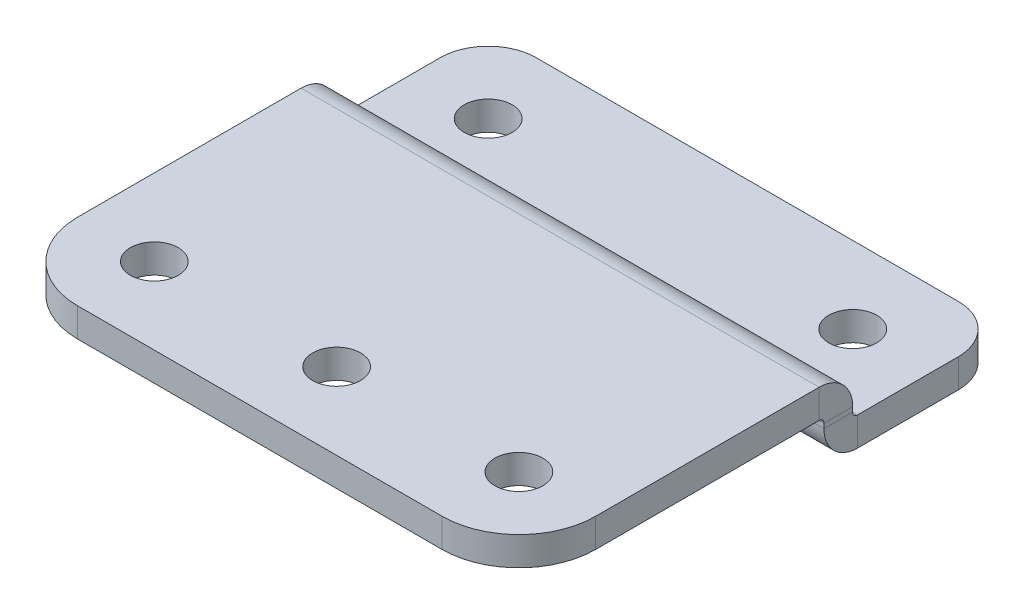
ISO-10303-21;
HEADER;
FILE_DESCRIPTION(('STEP AP214'),'2;1');
FILE_NAME('part.step','',(''),(''),'','','');
FILE_SCHEMA(('AUTOMOTIVE_DESIGN { 1 0 10303 214 1 1 1 1 }'));
ENDSEC;
DATA;
#1=APPLICATION_CONTEXT('core data for automotive mechanical design processes');
#2=APPLICATION_PROTOCOL_DEFINITION('international standard','automotive_design',2000,#1);
#3=PRODUCT_CONTEXT('',#1,'mechanical');
#4=PRODUCT('Part','Part','',(#3));
#5=PRODUCT_RELATED_PRODUCT_CATEGORY('part','',(#4));
#6=PRODUCT_DEFINITION_FORMATION('','',#4);
#7=PRODUCT_DEFINITION_CONTEXT('part definition',#1,'design');
#8=PRODUCT_DEFINITION('design','',#6,#7);
#9=PRODUCT_DEFINITION_SHAPE('','',#8);
#10=(LENGTH_UNIT() NAMED_UNIT(*) SI_UNIT(.MILLI.,.METRE.));
#11=(NAMED_UNIT(*) PLANE_ANGLE_UNIT() SI_UNIT($,.RADIAN.));
#12=(NAMED_UNIT(*) SI_UNIT($,.STERADIAN.) SOLID_ANGLE_UNIT());
#13=UNCERTAINTY_MEASURE_WITH_UNIT(LENGTH_MEASURE(1.E-05),#10,'distance_accuracy_value','');
#14=(GEOMETRIC_REPRESENTATION_CONTEXT(3) GLOBAL_UNCERTAINTY_ASSIGNED_CONTEXT((#13)) GLOBAL_UNIT_ASSIGNED_CONTEXT((#10,
#11,#12)) REPRESENTATION_CONTEXT('',''));
#15=CARTESIAN_POINT('',(0.,0.,0.));
#16=DIRECTION('',(0.,0.,1.));
#17=DIRECTION('',(1.,0.,0.));
#18=AXIS2_PLACEMENT_3D('',#15,#16,#17);
#19=CARTESIAN_POINT('',(0.,4.5,2.99999999999999));
#20=DIRECTION('',(1.,0.,0.));
#21=DIRECTION('',(0.,0.,-1.));
#22=AXIS2_PLACEMENT_3D('',#19,#20,#21);
#23=PLANE('',#22);
#24=DIRECTION('',(0.,1.,0.));
#25=VECTOR('',#24,1.);
#26=CARTESIAN_POINT('',(0.,-3.00000000000003,26.8));
#27=LINE('',#26,#25);
#28=CARTESIAN_POINT('',(0.,1.50000000000011,26.8));
#29=VERTEX_POINT('',#28);
#30=CARTESIAN_POINT('',(0.,4.50000000000008,26.8));
#31=VERTEX_POINT('',#30);
#32=EDGE_CURVE('E232',#29,#31,#27,.T.);
#33=ORIENTED_EDGE('',*,*,#32,.T.);
#34=DIRECTION('',(0.,0.,-1.));
#35=VECTOR('',#34,1.);
#36=CARTESIAN_POINT('',(0.,4.49999999999999,0.));
#37=LINE('',#36,#35);
#38=CARTESIAN_POINT('',(0.,4.5,3.49999999999999));
#39=VERTEX_POINT('',#38);
#40=EDGE_CURVE('E243',#39,#31,#37,.F.);
#41=ORIENTED_EDGE('',*,*,#40,.F.);
#42=DIRECTION('',(0.,-1.,0.));
#43=VECTOR('',#42,1.);
#44=CARTESIAN_POINT('',(0.,1.5,3.5));
#45=LINE('',#44,#43);
#46=CARTESIAN_POINT('',(0.,1.5,3.5));
#47=VERTEX_POINT('',#46);
#48=EDGE_CURVE('E264',#47,#39,#45,.F.);
#49=ORIENTED_EDGE('',*,*,#48,.F.);
#50=DIRECTION('',(0.,0.,1.));
#51=VECTOR('',#50,1.);
#52=CARTESIAN_POINT('',(0.,1.5,3.));
#53=LINE('',#52,#51);
#54=EDGE_CURVE('E245',#47,#29,#53,.T.);
#55=ORIENTED_EDGE('',*,*,#54,.T.);
#56=EDGE_LOOP('',(#33,#41,#49,#55));
#57=FACE_BOUND('',#56,.T.);
#58=ADVANCED_FACE('F117',(#57),#23,.F.);
#59=CARTESIAN_POINT('',(54.,4.50000000000011,34.8));
#60=DIRECTION('',(-1.,0.,0.));
#61=DIRECTION('',(0.,0.,1.));
#62=AXIS2_PLACEMENT_3D('',#59,#60,#61);
#63=PLANE('',#62);
#64=DIRECTION('',(0.,1.,0.));
#65=VECTOR('',#64,1.);
#66=CARTESIAN_POINT('',(54.,-3.00000000000003,26.8));
#67=LINE('',#66,#65);
#68=CARTESIAN_POINT('',(54.,1.50000000000009,26.8));
#69=VERTEX_POINT('',#68);
#70=CARTESIAN_POINT('',(54.,4.50000000000008,26.8));
#71=VERTEX_POINT('',#70);
#72=EDGE_CURVE('E530',#69,#71,#67,.T.);
#73=ORIENTED_EDGE('',*,*,#72,.F.);
#74=DIRECTION('',(0.,0.,-1.));
#75=VECTOR('',#74,1.);
#76=CARTESIAN_POINT('',(54.,1.50000000000011,34.8));
#77=LINE('',#76,#75);
#78=CARTESIAN_POINT('',(54.,1.5,3.5));
#79=VERTEX_POINT('',#78);
#80=EDGE_CURVE('E252',#69,#79,#77,.T.);
#81=ORIENTED_EDGE('',*,*,#80,.T.);
#82=DIRECTION('',(0.,-1.,0.));
#83=VECTOR('',#82,1.);
#84=CARTESIAN_POINT('',(54.,4.5,3.49999999999998));
#85=LINE('',#84,#83);
#86=CARTESIAN_POINT('',(54.,4.5,3.49999999999999));
#87=VERTEX_POINT('',#86);
#88=EDGE_CURVE('E269',#79,#87,#85,.F.);
#89=ORIENTED_EDGE('',*,*,#88,.T.);
#90=DIRECTION('',(0.,0.,1.));
#91=VECTOR('',#90,1.);
#92=CARTESIAN_POINT('',(54.,4.49999999999999,0.));
#93=LINE('',#92,#91);
#94=EDGE_CURVE('E254',#71,#87,#93,.F.);
#95=ORIENTED_EDGE('',*,*,#94,.F.);
#96=EDGE_LOOP('',(#73,#81,#89,#95));
#97=FACE_BOUND('',#96,.T.);
#98=ADVANCED_FACE('F413',(#97),#63,.F.);
#99=CARTESIAN_POINT('',(0.,4.49999999999999,0.));
#100=DIRECTION('',(0.,1.,0.));
#101=DIRECTION('',(0.,0.,1.));
#102=AXIS2_PLACEMENT_3D('',#99,#100,#101);
#103=PLANE('',#102);
#104=CARTESIAN_POINT('',(46.,4.50000000000008,26.8));
#105=DIRECTION('',(0.,1.,0.));
#106=DIRECTION('',(0.,0.,1.));
#107=AXIS2_PLACEMENT_3D('',#104,#105,#106);
#108=CIRCLE('',#107,2.5);
#109=CARTESIAN_POINT('',(46.,4.50000000000009,29.3));
#110=VERTEX_POINT('',#109);
#111=EDGE_CURVE('E807',#110,#110,#108,.T.);
#112=ORIENTED_EDGE('',*,*,#111,.F.);
#113=EDGE_LOOP('',(#112));
#114=FACE_BOUND('',#113,.T.);
#115=CARTESIAN_POINT('',(27.,4.50000000000008,26.8));
#116=DIRECTION('',(0.,1.,0.));
#117=DIRECTION('',(0.,0.,1.));
#118=AXIS2_PLACEMENT_3D('',#115,#116,#117);
#119=CIRCLE('',#118,2.5);
#120=CARTESIAN_POINT('',(27.,4.50000000000009,29.3));
#121=VERTEX_POINT('',#120);
#122=EDGE_CURVE('E811',#121,#121,#119,.T.);
#123=ORIENTED_EDGE('',*,*,#122,.F.);
#124=EDGE_LOOP('',(#123));
#125=FACE_BOUND('',#124,.T.);
#126=CARTESIAN_POINT('',(8.,4.50000000000008,26.8));
#127=DIRECTION('',(0.,1.,0.));
#128=DIRECTION('',(0.,0.,1.));
#129=AXIS2_PLACEMENT_3D('',#126,#127,#128);
#130=CIRCLE('',#129,2.5);
#131=CARTESIAN_POINT('',(8.,4.50000000000009,29.3));
#132=VERTEX_POINT('',#131);
#133=EDGE_CURVE('E237',#132,#132,#130,.F.);
#134=ORIENTED_EDGE('',*,*,#133,.T.);
#135=EDGE_LOOP('',(#134));
#136=FACE_BOUND('',#135,.T.);
#137=CARTESIAN_POINT('',(8.,4.50000000000008,26.8));
#138=DIRECTION('',(0.,1.,0.));
#139=DIRECTION('',(0.,0.,1.));
#140=AXIS2_PLACEMENT_3D('',#137,#138,#139);
#141=CIRCLE('',#140,8.);
#142=CARTESIAN_POINT('',(8.,4.50000000000011,34.8));
#143=VERTEX_POINT('',#142);
#144=EDGE_CURVE('E229',#143,#31,#141,.F.);
#145=ORIENTED_EDGE('',*,*,#144,.F.);
#146=DIRECTION('',(-1.,0.,0.));
#147=VECTOR('',#146,1.);
#148=CARTESIAN_POINT('',(0.,4.50000000000011,34.8));
#149=LINE('',#148,#147);
#150=CARTESIAN_POINT('',(46.,4.50000000000011,34.8));
#151=VERTEX_POINT('',#150);
#152=EDGE_CURVE('E251',#143,#151,#149,.F.);
#153=ORIENTED_EDGE('',*,*,#152,.T.);
#154=CARTESIAN_POINT('',(46.,4.50000000000008,26.8));
#155=DIRECTION('',(0.,1.,0.));
#156=DIRECTION('',(0.,0.,1.));
#157=AXIS2_PLACEMENT_3D('',#154,#155,#156);
#158=CIRCLE('',#157,8.);
#159=EDGE_CURVE('E134',#151,#71,#158,.T.);
#160=ORIENTED_EDGE('',*,*,#159,.T.);
#161=ORIENTED_EDGE('',*,*,#94,.T.);
#162=DIRECTION('',(-1.,0.,0.));
#163=VECTOR('',#162,1.);
#164=CARTESIAN_POINT('',(0.,4.5,3.49999999999999));
#165=LINE('',#164,#163);
#166=EDGE_CURVE('E250',#87,#39,#165,.T.);
#167=ORIENTED_EDGE('',*,*,#166,.T.);
#168=ORIENTED_EDGE('',*,*,#40,.T.);
#169=EDGE_LOOP('',(#145,#153,#160,#161,#167,#168));
#170=FACE_BOUND('',#169,.T.);
#171=ADVANCED_FACE('F248',(#114,#125,#136,#170),#103,.T.);
#172=CARTESIAN_POINT('',(0.,1.49999999999999,0.));
#173=DIRECTION('',(0.,1.,0.));
#174=DIRECTION('',(0.,0.,1.));
#175=AXIS2_PLACEMENT_3D('',#172,#173,#174);
#176=PLANE('',#175);
#177=CARTESIAN_POINT('',(27.,1.50000000000008,26.8));
#178=DIRECTION('',(0.,1.,0.));
#179=DIRECTION('',(0.,0.,1.));
#180=AXIS2_PLACEMENT_3D('',#177,#178,#179);
#181=CIRCLE('',#180,2.5);
#182=CARTESIAN_POINT('',(27.,1.50000000000009,29.3));
#183=VERTEX_POINT('',#182);
#184=EDGE_CURVE('E390',#183,#183,#181,.T.);
#185=ORIENTED_EDGE('',*,*,#184,.T.);
#186=EDGE_LOOP('',(#185));
#187=FACE_BOUND('',#186,.T.);
#188=CARTESIAN_POINT('',(8.,1.50000000000008,26.8));
#189=DIRECTION('',(0.,1.,0.));
#190=DIRECTION('',(0.,0.,1.));
#191=AXIS2_PLACEMENT_3D('',#188,#189,#190);
#192=CIRCLE('',#191,2.5);
#193=CARTESIAN_POINT('',(8.,1.50000000000009,29.3));
#194=VERTEX_POINT('',#193);
#195=EDGE_CURVE('E388',#194,#194,#192,.F.);
#196=ORIENTED_EDGE('',*,*,#195,.F.);
#197=EDGE_LOOP('',(#196));
#198=FACE_BOUND('',#197,.T.);
#199=CARTESIAN_POINT('',(46.,1.50000000000008,26.8));
#200=DIRECTION('',(0.,1.,0.));
#201=DIRECTION('',(0.,0.,1.));
#202=AXIS2_PLACEMENT_3D('',#199,#200,#201);
#203=CIRCLE('',#202,2.5);
#204=CARTESIAN_POINT('',(46.,1.50000000000009,29.3));
#205=VERTEX_POINT('',#204);
#206=EDGE_CURVE('E121',#205,#205,#203,.T.);
#207=ORIENTED_EDGE('',*,*,#206,.T.);
#208=EDGE_LOOP('',(#207));
#209=FACE_BOUND('',#208,.T.);
#210=DIRECTION('',(1.,0.,0.));
#211=VECTOR('',#210,1.);
#212=CARTESIAN_POINT('',(0.,1.50000000000011,34.8));
#213=LINE('',#212,#211);
#214=CARTESIAN_POINT('',(8.,1.50000000000011,34.8));
#215=VERTEX_POINT('',#214);
#216=CARTESIAN_POINT('',(46.,1.5000000000001,34.8));
#217=VERTEX_POINT('',#216);
#218=EDGE_CURVE('E256',#215,#217,#213,.T.);
#219=ORIENTED_EDGE('',*,*,#218,.F.);
#220=CARTESIAN_POINT('',(8.,1.50000000000008,26.8));
#221=DIRECTION('',(0.,1.,0.));
#222=DIRECTION('',(0.,0.,1.));
#223=AXIS2_PLACEMENT_3D('',#220,#221,#222);
#224=CIRCLE('',#223,8.);
#225=EDGE_CURVE('E142',#215,#29,#224,.F.);
#226=ORIENTED_EDGE('',*,*,#225,.T.);
#227=ORIENTED_EDGE('',*,*,#54,.F.);
#228=DIRECTION('',(1.,0.,0.));
#229=VECTOR('',#228,1.);
#230=CARTESIAN_POINT('',(54.,1.5,3.5));
#231=LINE('',#230,#229);
#232=EDGE_CURVE('E267',#79,#47,#231,.F.);
#233=ORIENTED_EDGE('',*,*,#232,.F.);
#234=ORIENTED_EDGE('',*,*,#80,.F.);
#235=CARTESIAN_POINT('',(46.,1.50000000000008,26.8));
#236=DIRECTION('',(0.,1.,0.));
#237=DIRECTION('',(0.,0.,1.));
#238=AXIS2_PLACEMENT_3D('',#235,#236,#237);
#239=CIRCLE('',#238,8.);
#240=EDGE_CURVE('E533',#217,#69,#239,.T.);
#241=ORIENTED_EDGE('',*,*,#240,.F.);
#242=EDGE_LOOP('',(#219,#226,#227,#233,#234,#241));
#243=FACE_BOUND('',#242,.T.);
#244=ADVANCED_FACE('F397',(#187,#198,#209,#243),#176,.F.);
#245=CARTESIAN_POINT('',(54.,-3.,0.));
#246=DIRECTION('',(1.,0.,0.));
#247=DIRECTION('',(0.,0.,-1.));
#248=AXIS2_PLACEMENT_3D('',#245,#246,#247);
#249=PLANE('',#248);
#250=DIRECTION('',(0.,0.,-1.));
#251=VECTOR('',#250,1.);
#252=CARTESIAN_POINT('',(54.,0.,0.));
#253=LINE('',#252,#251);
#254=CARTESIAN_POINT('',(54.,0.,-0.499999999999999));
#255=VERTEX_POINT('',#254);
#256=CARTESIAN_POINT('',(54.,0.,-11.));
#257=VERTEX_POINT('',#256);
#258=EDGE_CURVE('E369',#255,#257,#253,.T.);
#259=ORIENTED_EDGE('',*,*,#258,.F.);
#260=DIRECTION('',(0.,-1.,0.));
#261=VECTOR('',#260,1.);
#262=CARTESIAN_POINT('',(54.,0.,-0.499999999999999));
#263=LINE('',#262,#261);
#264=CARTESIAN_POINT('',(54.,-3.,-0.499999999999999));
#265=VERTEX_POINT('',#264);
#266=EDGE_CURVE('E323',#255,#265,#263,.T.);
#267=ORIENTED_EDGE('',*,*,#266,.T.);
#268=DIRECTION('',(0.,0.,-1.));
#269=VECTOR('',#268,1.);
#270=CARTESIAN_POINT('',(54.,-3.,0.));
#271=LINE('',#270,#269);
#272=CARTESIAN_POINT('',(54.,-3.,-11.));
#273=VERTEX_POINT('',#272);
#274=EDGE_CURVE('E354',#265,#273,#271,.T.);
#275=ORIENTED_EDGE('',*,*,#274,.T.);
#276=DIRECTION('',(0.,1.,0.));
#277=VECTOR('',#276,1.);
#278=CARTESIAN_POINT('',(54.,-3.,-11.));
#279=LINE('',#278,#277);
#280=EDGE_CURVE('E366',#273,#257,#279,.T.);
#281=ORIENTED_EDGE('',*,*,#280,.T.);
#282=EDGE_LOOP('',(#259,#267,#275,#281));
#283=FACE_BOUND('',#282,.T.);
#284=ADVANCED_FACE('F484',(#283),#249,.T.);
#285=CARTESIAN_POINT('',(4.99999999999999,-3.,-11.));
#286=DIRECTION('',(0.,-1.,0.));
#287=DIRECTION('',(0.,0.,-1.));
#288=AXIS2_PLACEMENT_3D('',#285,#286,#287);
#289=PLANE('',#288);
#290=CARTESIAN_POINT('',(46.,-3.,-8.00000000000001));
#291=DIRECTION('',(0.,1.,0.));
#292=DIRECTION('',(0.,0.,-1.));
#293=AXIS2_PLACEMENT_3D('',#290,#291,#292);
#294=CIRCLE('',#293,2.5);
#295=CARTESIAN_POINT('',(46.,-3.,-10.5));
#296=VERTEX_POINT('',#295);
#297=EDGE_CURVE('E339',#296,#296,#294,.T.);
#298=ORIENTED_EDGE('',*,*,#297,.T.);
#299=EDGE_LOOP('',(#298));
#300=FACE_BOUND('',#299,.T.);
#301=CARTESIAN_POINT('',(8.,-3.,-8.));
#302=DIRECTION('',(0.,1.,0.));
#303=DIRECTION('',(0.,0.,1.));
#304=AXIS2_PLACEMENT_3D('',#301,#302,#303);
#305=CIRCLE('',#304,2.5);
#306=CARTESIAN_POINT('',(8.,-3.,-5.5));
#307=VERTEX_POINT('',#306);
#308=EDGE_CURVE('E345',#307,#307,#305,.T.);
#309=ORIENTED_EDGE('',*,*,#308,.T.);
#310=EDGE_LOOP('',(#309));
#311=FACE_BOUND('',#310,.T.);
#312=ORIENTED_EDGE('',*,*,#274,.F.);
#313=DIRECTION('',(1.,0.,0.));
#314=VECTOR('',#313,1.);
#315=CARTESIAN_POINT('',(54.,-3.,-0.499999999999999));
#316=LINE('',#315,#314);
#317=CARTESIAN_POINT('',(0.,-3.,-0.499999999999999));
#318=VERTEX_POINT('',#317);
#319=EDGE_CURVE('E316',#265,#318,#316,.F.);
#320=ORIENTED_EDGE('',*,*,#319,.T.);
#321=DIRECTION('',(0.,0.,1.));
#322=VECTOR('',#321,1.);
#323=CARTESIAN_POINT('',(0.,-3.,0.));
#324=LINE('',#323,#322);
#325=CARTESIAN_POINT('',(0.,-3.,-11.));
#326=VERTEX_POINT('',#325);
#327=EDGE_CURVE('E351',#326,#318,#324,.T.);
#328=ORIENTED_EDGE('',*,*,#327,.F.);
#329=CARTESIAN_POINT('',(4.99999999999999,-3.,-11.));
#330=DIRECTION('',(0.,1.,0.));
#331=DIRECTION('',(0.,0.,-1.));
#332=AXIS2_PLACEMENT_3D('',#329,#330,#331);
#333=CIRCLE('',#332,5.);
#334=CARTESIAN_POINT('',(4.99999999999999,-3.,-16.));
#335=VERTEX_POINT('',#334);
#336=EDGE_CURVE('E363',#335,#326,#333,.T.);
#337=ORIENTED_EDGE('',*,*,#336,.F.);
#338=DIRECTION('',(-1.,0.,0.));
#339=VECTOR('',#338,1.);
#340=CARTESIAN_POINT('',(4.99999999999999,-3.,-16.));
#341=LINE('',#340,#339);
#342=CARTESIAN_POINT('',(49.,-3.,-16.));
#343=VERTEX_POINT('',#342);
#344=EDGE_CURVE('E360',#343,#335,#341,.T.);
#345=ORIENTED_EDGE('',*,*,#344,.F.);
#346=CARTESIAN_POINT('',(49.,-3.,-11.));
#347=DIRECTION('',(0.,1.,0.));
#348=DIRECTION('',(0.,0.,-1.));
#349=AXIS2_PLACEMENT_3D('',#346,#347,#348);
#350=CIRCLE('',#349,5.);
#351=EDGE_CURVE('E357',#273,#343,#350,.T.);
#352=ORIENTED_EDGE('',*,*,#351,.F.);
#353=EDGE_LOOP('',(#312,#320,#328,#337,#345,#352));
#354=FACE_BOUND('',#353,.T.);
#355=ADVANCED_FACE('F480',(#300,#311,#354),#289,.T.);
#356=CARTESIAN_POINT('',(4.99999999999999,0.,-11.));
#357=DIRECTION('',(0.,-1.,0.));
#358=DIRECTION('',(0.,0.,-1.));
#359=AXIS2_PLACEMENT_3D('',#356,#357,#358);
#360=PLANE('',#359);
#361=CARTESIAN_POINT('',(8.,0.,-8.));
#362=DIRECTION('',(0.,1.,0.));
#363=DIRECTION('',(0.,0.,1.));
#364=AXIS2_PLACEMENT_3D('',#361,#362,#363);
#365=CIRCLE('',#364,2.5);
#366=CARTESIAN_POINT('',(8.,0.,-5.5));
#367=VERTEX_POINT('',#366);
#368=EDGE_CURVE('E342',#367,#367,#365,.T.);
#369=ORIENTED_EDGE('',*,*,#368,.F.);
#370=EDGE_LOOP('',(#369));
#371=FACE_BOUND('',#370,.T.);
#372=CARTESIAN_POINT('',(46.,0.,-8.00000000000001));
#373=DIRECTION('',(0.,1.,0.));
#374=DIRECTION('',(0.,0.,-1.));
#375=AXIS2_PLACEMENT_3D('',#372,#373,#374);
#376=CIRCLE('',#375,2.5);
#377=CARTESIAN_POINT('',(46.,0.,-10.5));
#378=VERTEX_POINT('',#377);
#379=EDGE_CURVE('E336',#378,#378,#376,.T.);
#380=ORIENTED_EDGE('',*,*,#379,.F.);
#381=EDGE_LOOP('',(#380));
#382=FACE_BOUND('',#381,.T.);
#383=DIRECTION('',(1.,0.,0.));
#384=VECTOR('',#383,1.);
#385=CARTESIAN_POINT('',(54.,0.,-0.499999999999999));
#386=LINE('',#385,#384);
#387=CARTESIAN_POINT('',(0.,0.,-0.499999999999999));
#388=VERTEX_POINT('',#387);
#389=EDGE_CURVE('E329',#255,#388,#386,.F.);
#390=ORIENTED_EDGE('',*,*,#389,.F.);
#391=ORIENTED_EDGE('',*,*,#258,.T.);
#392=CARTESIAN_POINT('',(49.,0.,-11.));
#393=DIRECTION('',(0.,1.,0.));
#394=DIRECTION('',(0.,0.,-1.));
#395=AXIS2_PLACEMENT_3D('',#392,#393,#394);
#396=CIRCLE('',#395,5.);
#397=CARTESIAN_POINT('',(49.,0.,-16.));
#398=VERTEX_POINT('',#397);
#399=EDGE_CURVE('E371',#257,#398,#396,.T.);
#400=ORIENTED_EDGE('',*,*,#399,.T.);
#401=DIRECTION('',(-1.,0.,0.));
#402=VECTOR('',#401,1.);
#403=CARTESIAN_POINT('',(4.99999999999999,0.,-16.));
#404=LINE('',#403,#402);
#405=CARTESIAN_POINT('',(4.99999999999999,0.,-16.));
#406=VERTEX_POINT('',#405);
#407=EDGE_CURVE('E374',#398,#406,#404,.T.);
#408=ORIENTED_EDGE('',*,*,#407,.T.);
#409=CARTESIAN_POINT('',(4.99999999999999,0.,-11.));
#410=DIRECTION('',(0.,1.,0.));
#411=DIRECTION('',(0.,0.,-1.));
#412=AXIS2_PLACEMENT_3D('',#409,#410,#411);
#413=CIRCLE('',#412,5.);
#414=CARTESIAN_POINT('',(0.,0.,-11.));
#415=VERTEX_POINT('',#414);
#416=EDGE_CURVE('E355',#406,#415,#413,.T.);
#417=ORIENTED_EDGE('',*,*,#416,.T.);
#418=DIRECTION('',(0.,0.,1.));
#419=VECTOR('',#418,1.);
#420=CARTESIAN_POINT('',(0.,0.,0.));
#421=LINE('',#420,#419);
#422=EDGE_CURVE('E348',#415,#388,#421,.T.);
#423=ORIENTED_EDGE('',*,*,#422,.T.);
#424=EDGE_LOOP('',(#390,#391,#400,#408,#417,#423));
#425=FACE_BOUND('',#424,.T.);
#426=ADVANCED_FACE('F483',(#371,#382,#425),#360,.F.);
#427=CARTESIAN_POINT('',(0.,-3.,0.));
#428=DIRECTION('',(-1.,0.,0.));
#429=DIRECTION('',(0.,0.,1.));
#430=AXIS2_PLACEMENT_3D('',#427,#428,#429);
#431=PLANE('',#430);
#432=DIRECTION('',(0.,-1.,0.));
#433=VECTOR('',#432,1.);
#434=CARTESIAN_POINT('',(0.,0.,-0.499999999999999));
#435=LINE('',#434,#433);
#436=EDGE_CURVE('E333',#388,#318,#435,.T.);
#437=ORIENTED_EDGE('',*,*,#436,.F.);
#438=ORIENTED_EDGE('',*,*,#422,.F.);
#439=DIRECTION('',(0.,1.,0.));
#440=VECTOR('',#439,1.);
#441=CARTESIAN_POINT('',(0.,-3.,-11.));
#442=LINE('',#441,#440);
#443=EDGE_CURVE('E379',#326,#415,#442,.T.);
#444=ORIENTED_EDGE('',*,*,#443,.F.);
#445=ORIENTED_EDGE('',*,*,#327,.T.);
#446=EDGE_LOOP('',(#437,#438,#444,#445));
#447=FACE_BOUND('',#446,.T.);
#448=ADVANCED_FACE('F119',(#447),#431,.T.);
#449=CARTESIAN_POINT('',(4.99999999999999,-3.,-11.));
#450=DIRECTION('',(0.,1.,0.));
#451=DIRECTION('',(0.,0.,1.));
#452=AXIS2_PLACEMENT_3D('',#449,#450,#451);
#453=CYLINDRICAL_SURFACE('',#452,5.);
#454=ORIENTED_EDGE('',*,*,#416,.F.);
#455=DIRECTION('',(0.,1.,0.));
#456=VECTOR('',#455,1.);
#457=CARTESIAN_POINT('',(4.99999999999999,-3.,-16.));
#458=LINE('',#457,#456);
#459=EDGE_CURVE('E381',#335,#406,#458,.T.);
#460=ORIENTED_EDGE('',*,*,#459,.F.);
#461=ORIENTED_EDGE('',*,*,#336,.T.);
#462=ORIENTED_EDGE('',*,*,#443,.T.);
#463=EDGE_LOOP('',(#454,#460,#461,#462));
#464=FACE_BOUND('',#463,.T.);
#465=ADVANCED_FACE('F489',(#464),#453,.T.);
#466=CARTESIAN_POINT('',(4.99999999999999,-3.,-16.));
#467=DIRECTION('',(0.,0.,-1.));
#468=DIRECTION('',(-1.,0.,0.));
#469=AXIS2_PLACEMENT_3D('',#466,#467,#468);
#470=PLANE('',#469);
#471=ORIENTED_EDGE('',*,*,#407,.F.);
#472=DIRECTION('',(0.,1.,0.));
#473=VECTOR('',#472,1.);
#474=CARTESIAN_POINT('',(49.,-3.,-16.));
#475=LINE('',#474,#473);
#476=EDGE_CURVE('E383',#343,#398,#475,.T.);
#477=ORIENTED_EDGE('',*,*,#476,.F.);
#478=ORIENTED_EDGE('',*,*,#344,.T.);
#479=ORIENTED_EDGE('',*,*,#459,.T.);
#480=EDGE_LOOP('',(#471,#477,#478,#479));
#481=FACE_BOUND('',#480,.T.);
#482=ADVANCED_FACE('F492',(#481),#470,.T.);
#483=CARTESIAN_POINT('',(49.,-3.,-11.));
#484=DIRECTION('',(0.,1.,0.));
#485=DIRECTION('',(0.,0.,1.));
#486=AXIS2_PLACEMENT_3D('',#483,#484,#485);
#487=CYLINDRICAL_SURFACE('',#486,5.);
#488=ORIENTED_EDGE('',*,*,#399,.F.);
#489=ORIENTED_EDGE('',*,*,#280,.F.);
#490=ORIENTED_EDGE('',*,*,#351,.T.);
#491=ORIENTED_EDGE('',*,*,#476,.T.);
#492=EDGE_LOOP('',(#488,#489,#490,#491));
#493=FACE_BOUND('',#492,.T.);
#494=ADVANCED_FACE('F478',(#493),#487,.T.);
#495=CARTESIAN_POINT('',(8.,-3.,-8.));
#496=DIRECTION('',(0.,1.,0.));
#497=DIRECTION('',(0.,0.,1.));
#498=AXIS2_PLACEMENT_3D('',#495,#496,#497);
#499=CYLINDRICAL_SURFACE('',#498,2.5);
#500=ORIENTED_EDGE('',*,*,#308,.F.);
#501=EDGE_LOOP('',(#500));
#502=FACE_BOUND('',#501,.T.);
#503=ORIENTED_EDGE('',*,*,#368,.T.);
#504=EDGE_LOOP('',(#503));
#505=FACE_BOUND('',#504,.T.);
#506=ADVANCED_FACE('F474',(#502,#505),#499,.F.);
#507=CARTESIAN_POINT('',(46.,-3.,-8.00000000000001));
#508=DIRECTION('',(0.,1.,0.));
#509=DIRECTION('',(0.,0.,1.));
#510=AXIS2_PLACEMENT_3D('',#507,#508,#509);
#511=CYLINDRICAL_SURFACE('',#510,2.5);
#512=ORIENTED_EDGE('',*,*,#297,.F.);
#513=EDGE_LOOP('',(#512));
#514=FACE_BOUND('',#513,.T.);
#515=ORIENTED_EDGE('',*,*,#379,.T.);
#516=EDGE_LOOP('',(#515));
#517=FACE_BOUND('',#516,.T.);
#518=ADVANCED_FACE('F467',(#514,#517),#511,.F.);
#519=CARTESIAN_POINT('',(0.,0.499999999999998,-0.499999999999999));
#520=DIRECTION('',(-1.,0.,0.));
#521=DIRECTION('',(0.,0.,1.));
#522=AXIS2_PLACEMENT_3D('',#519,#520,#521);
#523=PLANE('',#522);
#524=DIRECTION('',(0.,0.,1.));
#525=VECTOR('',#524,1.);
#526=CARTESIAN_POINT('',(0.,0.499999999999998,0.));
#527=LINE('',#526,#525);
#528=CARTESIAN_POINT('',(0.,0.499999999999998,0.));
#529=VERTEX_POINT('',#528);
#530=CARTESIAN_POINT('',(0.,0.499999999999998,3.));
#531=VERTEX_POINT('',#530);
#532=EDGE_CURVE('E275',#529,#531,#527,.T.);
#533=ORIENTED_EDGE('',*,*,#532,.F.);
#534=CARTESIAN_POINT('',(0.,0.499999999999998,-0.499999999999999));
#535=DIRECTION('',(1.,0.,0.));
#536=DIRECTION('',(0.,0.,-1.));
#537=AXIS2_PLACEMENT_3D('',#534,#535,#536);
#538=CIRCLE('',#537,0.499999999999999);
#539=EDGE_CURVE('E326',#388,#529,#538,.F.);
#540=ORIENTED_EDGE('',*,*,#539,.F.);
#541=ORIENTED_EDGE('',*,*,#436,.T.);
#542=CARTESIAN_POINT('',(0.,0.499999999999998,-0.499999999999999));
#543=DIRECTION('',(1.,0.,0.));
#544=DIRECTION('',(0.,0.,-1.));
#545=AXIS2_PLACEMENT_3D('',#542,#543,#544);
#546=CIRCLE('',#545,3.5);
#547=EDGE_CURVE('E319',#318,#531,#546,.F.);
#548=ORIENTED_EDGE('',*,*,#547,.T.);
#549=EDGE_LOOP('',(#533,#540,#541,#548));
#550=FACE_BOUND('',#549,.T.);
#551=ADVANCED_FACE('F464',(#550),#523,.T.);
#552=CARTESIAN_POINT('',(54.,0.499999999999998,-0.499999999999999));
#553=DIRECTION('',(-1.,0.,0.));
#554=DIRECTION('',(0.,0.,1.));
#555=AXIS2_PLACEMENT_3D('',#552,#553,#554);
#556=PLANE('',#555);
#557=CARTESIAN_POINT('',(54.,0.499999999999998,-0.499999999999999));
#558=DIRECTION('',(1.,0.,0.));
#559=DIRECTION('',(0.,0.,-1.));
#560=AXIS2_PLACEMENT_3D('',#557,#558,#559);
#561=CIRCLE('',#560,0.499999999999999);
#562=CARTESIAN_POINT('',(54.,0.499999999999998,0.));
#563=VERTEX_POINT('',#562);
#564=EDGE_CURVE('E315',#563,#255,#561,.T.);
#565=ORIENTED_EDGE('',*,*,#564,.F.);
#566=DIRECTION('',(0.,0.,1.));
#567=VECTOR('',#566,1.);
#568=CARTESIAN_POINT('',(54.,0.499999999999998,0.));
#569=LINE('',#568,#567);
#570=CARTESIAN_POINT('',(54.,0.499999999999998,3.));
#571=VERTEX_POINT('',#570);
#572=EDGE_CURVE('E287',#563,#571,#569,.T.);
#573=ORIENTED_EDGE('',*,*,#572,.T.);
#574=CARTESIAN_POINT('',(54.,0.499999999999998,-0.499999999999999));
#575=DIRECTION('',(1.,0.,0.));
#576=DIRECTION('',(0.,0.,-1.));
#577=AXIS2_PLACEMENT_3D('',#574,#575,#576);
#578=CIRCLE('',#577,3.5);
#579=EDGE_CURVE('E320',#571,#265,#578,.T.);
#580=ORIENTED_EDGE('',*,*,#579,.T.);
#581=ORIENTED_EDGE('',*,*,#266,.F.);
#582=EDGE_LOOP('',(#565,#573,#580,#581));
#583=FACE_BOUND('',#582,.T.);
#584=ADVANCED_FACE('F459',(#583),#556,.F.);
#585=CARTESIAN_POINT('',(54.,0.499999999999998,-0.499999999999999));
#586=DIRECTION('',(1.,0.,0.));
#587=DIRECTION('',(0.,0.,1.));
#588=AXIS2_PLACEMENT_3D('',#585,#586,#587);
#589=CYLINDRICAL_SURFACE('',#588,3.5);
#590=ORIENTED_EDGE('',*,*,#319,.F.);
#591=ORIENTED_EDGE('',*,*,#579,.F.);
#592=DIRECTION('',(-1.,0.,0.));
#593=VECTOR('',#592,1.);
#594=CARTESIAN_POINT('',(0.,0.499999999999998,3.));
#595=LINE('',#594,#593);
#596=EDGE_CURVE('E290',#571,#531,#595,.T.);
#597=ORIENTED_EDGE('',*,*,#596,.T.);
#598=ORIENTED_EDGE('',*,*,#547,.F.);
#599=EDGE_LOOP('',(#590,#591,#597,#598));
#600=FACE_BOUND('',#599,.T.);
#601=ADVANCED_FACE('F456',(#600),#589,.T.);
#602=CARTESIAN_POINT('',(54.,0.499999999999998,-0.499999999999999));
#603=DIRECTION('',(1.,0.,0.));
#604=DIRECTION('',(0.,0.,1.));
#605=AXIS2_PLACEMENT_3D('',#602,#603,#604);
#606=CYLINDRICAL_SURFACE('',#605,0.499999999999999);
#607=ORIENTED_EDGE('',*,*,#389,.T.);
#608=ORIENTED_EDGE('',*,*,#539,.T.);
#609=DIRECTION('',(1.,0.,0.));
#610=VECTOR('',#609,1.);
#611=CARTESIAN_POINT('',(0.,0.499999999999998,0.));
#612=LINE('',#611,#610);
#613=EDGE_CURVE('E285',#529,#563,#612,.T.);
#614=ORIENTED_EDGE('',*,*,#613,.T.);
#615=ORIENTED_EDGE('',*,*,#564,.T.);
#616=EDGE_LOOP('',(#607,#608,#614,#615));
#617=FACE_BOUND('',#616,.T.);
#618=ADVANCED_FACE('F454',(#617),#606,.F.);
#619=CARTESIAN_POINT('',(0.,0.,3.));
#620=DIRECTION('',(1.,0.,0.));
#621=DIRECTION('',(0.,0.,-1.));
#622=AXIS2_PLACEMENT_3D('',#619,#620,#621);
#623=PLANE('',#622);
#624=ORIENTED_EDGE('',*,*,#532,.T.);
#625=DIRECTION('',(0.,-1.,0.));
#626=VECTOR('',#625,1.);
#627=CARTESIAN_POINT('',(0.,0.,3.));
#628=LINE('',#627,#626);
#629=CARTESIAN_POINT('',(0.,0.999999999999998,3.));
#630=VERTEX_POINT('',#629);
#631=EDGE_CURVE('E295',#630,#531,#628,.T.);
#632=ORIENTED_EDGE('',*,*,#631,.F.);
#633=DIRECTION('',(0.,0.,-1.));
#634=VECTOR('',#633,1.);
#635=CARTESIAN_POINT('',(0.,0.999999999999998,3.));
#636=LINE('',#635,#634);
#637=CARTESIAN_POINT('',(0.,0.999999999999998,0.));
#638=VERTEX_POINT('',#637);
#639=EDGE_CURVE('E303',#630,#638,#636,.T.);
#640=ORIENTED_EDGE('',*,*,#639,.T.);
#641=DIRECTION('',(0.,-1.,0.));
#642=VECTOR('',#641,1.);
#643=CARTESIAN_POINT('',(0.,0.,0.));
#644=LINE('',#643,#642);
#645=EDGE_CURVE('E294',#638,#529,#644,.T.);
#646=ORIENTED_EDGE('',*,*,#645,.T.);
#647=EDGE_LOOP('',(#624,#632,#640,#646));
#648=FACE_BOUND('',#647,.T.);
#649=ADVANCED_FACE('F450',(#648),#623,.F.);
#650=CARTESIAN_POINT('',(54.,0.999999999999998,3.));
#651=DIRECTION('',(-1.,0.,0.));
#652=DIRECTION('',(0.,0.,1.));
#653=AXIS2_PLACEMENT_3D('',#650,#651,#652);
#654=PLANE('',#653);
#655=ORIENTED_EDGE('',*,*,#572,.F.);
#656=DIRECTION('',(0.,1.,0.));
#657=VECTOR('',#656,1.);
#658=CARTESIAN_POINT('',(54.,0.999999999999998,0.));
#659=LINE('',#658,#657);
#660=CARTESIAN_POINT('',(54.,0.999999999999998,0.));
#661=VERTEX_POINT('',#660);
#662=EDGE_CURVE('E306',#563,#661,#659,.T.);
#663=ORIENTED_EDGE('',*,*,#662,.T.);
#664=DIRECTION('',(0.,0.,-1.));
#665=VECTOR('',#664,1.);
#666=CARTESIAN_POINT('',(54.,0.999999999999998,3.));
#667=LINE('',#666,#665);
#668=CARTESIAN_POINT('',(54.,0.999999999999998,3.));
#669=VERTEX_POINT('',#668);
#670=EDGE_CURVE('E312',#669,#661,#667,.T.);
#671=ORIENTED_EDGE('',*,*,#670,.F.);
#672=DIRECTION('',(0.,1.,0.));
#673=VECTOR('',#672,1.);
#674=CARTESIAN_POINT('',(54.,0.999999999999998,3.));
#675=LINE('',#674,#673);
#676=EDGE_CURVE('E298',#571,#669,#675,.T.);
#677=ORIENTED_EDGE('',*,*,#676,.F.);
#678=EDGE_LOOP('',(#655,#663,#671,#677));
#679=FACE_BOUND('',#678,.T.);
#680=ADVANCED_FACE('F443',(#679),#654,.F.);
#681=CARTESIAN_POINT('',(0.,0.,3.));
#682=DIRECTION('',(0.,0.,-1.));
#683=DIRECTION('',(-1.,0.,0.));
#684=AXIS2_PLACEMENT_3D('',#681,#682,#683);
#685=PLANE('',#684);
#686=ORIENTED_EDGE('',*,*,#596,.F.);
#687=ORIENTED_EDGE('',*,*,#676,.T.);
#688=DIRECTION('',(-1.,0.,0.));
#689=VECTOR('',#688,1.);
#690=CARTESIAN_POINT('',(0.,0.999999999999998,3.));
#691=LINE('',#690,#689);
#692=EDGE_CURVE('E301',#669,#630,#691,.T.);
#693=ORIENTED_EDGE('',*,*,#692,.T.);
#694=ORIENTED_EDGE('',*,*,#631,.T.);
#695=EDGE_LOOP('',(#686,#687,#693,#694));
#696=FACE_BOUND('',#695,.T.);
#697=ADVANCED_FACE('F440',(#696),#685,.F.);
#698=CARTESIAN_POINT('',(0.,0.,0.));
#699=DIRECTION('',(0.,0.,-1.));
#700=DIRECTION('',(-1.,0.,0.));
#701=AXIS2_PLACEMENT_3D('',#698,#699,#700);
#702=PLANE('',#701);
#703=ORIENTED_EDGE('',*,*,#662,.F.);
#704=ORIENTED_EDGE('',*,*,#613,.F.);
#705=ORIENTED_EDGE('',*,*,#645,.F.);
#706=DIRECTION('',(-1.,0.,0.));
#707=VECTOR('',#706,1.);
#708=CARTESIAN_POINT('',(0.,0.999999999999998,0.));
#709=LINE('',#708,#707);
#710=EDGE_CURVE('E299',#661,#638,#709,.T.);
#711=ORIENTED_EDGE('',*,*,#710,.F.);
#712=EDGE_LOOP('',(#703,#704,#705,#711));
#713=FACE_BOUND('',#712,.T.);
#714=ADVANCED_FACE('F435',(#713),#702,.T.);
#715=CARTESIAN_POINT('',(54.,0.999999999999998,3.5));
#716=DIRECTION('',(1.,0.,0.));
#717=DIRECTION('',(0.,0.,-1.));
#718=AXIS2_PLACEMENT_3D('',#715,#716,#717);
#719=PLANE('',#718);
#720=ORIENTED_EDGE('',*,*,#88,.F.);
#721=CARTESIAN_POINT('',(54.,0.999999999999998,3.5));
#722=DIRECTION('',(-1.,0.,0.));
#723=DIRECTION('',(0.,0.,1.));
#724=AXIS2_PLACEMENT_3D('',#721,#722,#723);
#725=CIRCLE('',#724,0.5);
#726=EDGE_CURVE('E279',#669,#79,#725,.F.);
#727=ORIENTED_EDGE('',*,*,#726,.F.);
#728=ORIENTED_EDGE('',*,*,#670,.T.);
#729=CARTESIAN_POINT('',(54.,0.999999999999998,3.5));
#730=DIRECTION('',(-1.,0.,0.));
#731=DIRECTION('',(0.,0.,1.));
#732=AXIS2_PLACEMENT_3D('',#729,#730,#731);
#733=CIRCLE('',#732,3.5);
#734=EDGE_CURVE('E272',#661,#87,#733,.F.);
#735=ORIENTED_EDGE('',*,*,#734,.T.);
#736=EDGE_LOOP('',(#720,#727,#728,#735));
#737=FACE_BOUND('',#736,.T.);
#738=ADVANCED_FACE('F432',(#737),#719,.T.);
#739=CARTESIAN_POINT('',(0.,0.999999999999998,3.5));
#740=DIRECTION('',(1.,0.,0.));
#741=DIRECTION('',(0.,0.,-1.));
#742=AXIS2_PLACEMENT_3D('',#739,#740,#741);
#743=PLANE('',#742);
#744=CARTESIAN_POINT('',(0.,0.999999999999998,3.5));
#745=DIRECTION('',(-1.,0.,0.));
#746=DIRECTION('',(0.,0.,1.));
#747=AXIS2_PLACEMENT_3D('',#744,#745,#746);
#748=CIRCLE('',#747,0.5);
#749=EDGE_CURVE('E282',#47,#630,#748,.T.);
#750=ORIENTED_EDGE('',*,*,#749,.F.);
#751=ORIENTED_EDGE('',*,*,#48,.T.);
#752=CARTESIAN_POINT('',(0.,0.999999999999998,3.5));
#753=DIRECTION('',(-1.,0.,0.));
#754=DIRECTION('',(0.,0.,1.));
#755=AXIS2_PLACEMENT_3D('',#752,#753,#754);
#756=CIRCLE('',#755,3.5);
#757=EDGE_CURVE('E276',#39,#638,#756,.T.);
#758=ORIENTED_EDGE('',*,*,#757,.T.);
#759=ORIENTED_EDGE('',*,*,#639,.F.);
#760=EDGE_LOOP('',(#750,#751,#758,#759));
#761=FACE_BOUND('',#760,.T.);
#762=ADVANCED_FACE('F427',(#761),#743,.F.);
#763=CARTESIAN_POINT('',(0.,0.999999999999998,3.5));
#764=DIRECTION('',(-1.,0.,0.));
#765=DIRECTION('',(0.,1.,0.));
#766=AXIS2_PLACEMENT_3D('',#763,#764,#765);
#767=CYLINDRICAL_SURFACE('',#766,3.5);
#768=ORIENTED_EDGE('',*,*,#710,.T.);
#769=ORIENTED_EDGE('',*,*,#757,.F.);
#770=ORIENTED_EDGE('',*,*,#166,.F.);
#771=ORIENTED_EDGE('',*,*,#734,.F.);
#772=EDGE_LOOP('',(#768,#769,#770,#771));
#773=FACE_BOUND('',#772,.T.);
#774=ADVANCED_FACE('F423',(#773),#767,.T.);
#775=CARTESIAN_POINT('',(0.,0.999999999999998,3.5));
#776=DIRECTION('',(-1.,0.,0.));
#777=DIRECTION('',(0.,1.,0.));
#778=AXIS2_PLACEMENT_3D('',#775,#776,#777);
#779=CYLINDRICAL_SURFACE('',#778,0.5);
#780=ORIENTED_EDGE('',*,*,#692,.F.);
#781=ORIENTED_EDGE('',*,*,#726,.T.);
#782=ORIENTED_EDGE('',*,*,#232,.T.);
#783=ORIENTED_EDGE('',*,*,#749,.T.);
#784=EDGE_LOOP('',(#780,#781,#782,#783));
#785=FACE_BOUND('',#784,.T.);
#786=ADVANCED_FACE('F426',(#785),#779,.F.);
#787=CARTESIAN_POINT('',(0.,4.50000000000011,34.8));
#788=DIRECTION('',(0.,0.,-1.));
#789=DIRECTION('',(0.,1.,0.));
#790=AXIS2_PLACEMENT_3D('',#787,#788,#789);
#791=PLANE('',#790);
#792=ORIENTED_EDGE('',*,*,#152,.F.);
#793=DIRECTION('',(0.,1.,0.));
#794=VECTOR('',#793,1.);
#795=CARTESIAN_POINT('',(8.,-3.,34.8));
#796=LINE('',#795,#794);
#797=EDGE_CURVE('E13',#143,#215,#796,.F.);
#798=ORIENTED_EDGE('',*,*,#797,.T.);
#799=ORIENTED_EDGE('',*,*,#218,.T.);
#800=DIRECTION('',(0.,1.,0.));
#801=VECTOR('',#800,1.);
#802=CARTESIAN_POINT('',(46.,-3.,34.8));
#803=LINE('',#802,#801);
#804=EDGE_CURVE('E126',#217,#151,#803,.T.);
#805=ORIENTED_EDGE('',*,*,#804,.T.);
#806=EDGE_LOOP('',(#792,#798,#799,#805));
#807=FACE_BOUND('',#806,.T.);
#808=ADVANCED_FACE('F422',(#807),#791,.F.);
#809=CARTESIAN_POINT('',(46.,-3.00000000000003,26.8));
#810=DIRECTION('',(0.,1.,0.));
#811=DIRECTION('',(0.,0.,1.));
#812=AXIS2_PLACEMENT_3D('',#809,#810,#811);
#813=CYLINDRICAL_SURFACE('',#812,8.);
#814=ORIENTED_EDGE('',*,*,#240,.T.);
#815=ORIENTED_EDGE('',*,*,#72,.T.);
#816=ORIENTED_EDGE('',*,*,#159,.F.);
#817=ORIENTED_EDGE('',*,*,#804,.F.);
#818=EDGE_LOOP('',(#814,#815,#816,#817));
#819=FACE_BOUND('',#818,.T.);
#820=ADVANCED_FACE('F624',(#819),#813,.T.);
#821=CARTESIAN_POINT('',(8.,-3.00000000000003,26.8));
#822=DIRECTION('',(0.,1.,0.));
#823=DIRECTION('',(0.,0.,1.));
#824=AXIS2_PLACEMENT_3D('',#821,#822,#823);
#825=CYLINDRICAL_SURFACE('',#824,8.);
#826=ORIENTED_EDGE('',*,*,#797,.F.);
#827=ORIENTED_EDGE('',*,*,#144,.T.);
#828=ORIENTED_EDGE('',*,*,#32,.F.);
#829=ORIENTED_EDGE('',*,*,#225,.F.);
#830=EDGE_LOOP('',(#826,#827,#828,#829));
#831=FACE_BOUND('',#830,.T.);
#832=ADVANCED_FACE('F231',(#831),#825,.T.);
#833=CARTESIAN_POINT('',(8.,-3.00000000000003,26.8));
#834=DIRECTION('',(0.,1.,0.));
#835=DIRECTION('',(0.,0.,1.));
#836=AXIS2_PLACEMENT_3D('',#833,#834,#835);
#837=CYLINDRICAL_SURFACE('',#836,2.5);
#838=CARTESIAN_POINT('',(8.,4.50000000000009,29.3));
#839=CARTESIAN_POINT('',(8.,4.46875000000009,29.3));
#840=CARTESIAN_POINT('',(8.,4.43750000000009,29.3));
#841=CARTESIAN_POINT('',(8.,4.37500000000009,29.3));
#842=CARTESIAN_POINT('',(8.,4.34375000000009,29.3));
#843=CARTESIAN_POINT('',(8.,4.28125000000009,29.3));
#844=CARTESIAN_POINT('',(8.,4.25000000000009,29.3));
#845=CARTESIAN_POINT('',(8.,4.18750000000009,29.3));
#846=CARTESIAN_POINT('',(8.,4.15625000000009,29.3));
#847=CARTESIAN_POINT('',(8.,4.09375000000009,29.3));
#848=CARTESIAN_POINT('',(8.,4.06250000000009,29.3));
#849=CARTESIAN_POINT('',(8.,4.00000000000009,29.3));
#850=CARTESIAN_POINT('',(8.,3.96875000000009,29.3));
#851=CARTESIAN_POINT('',(8.,3.90625000000009,29.3));
#852=CARTESIAN_POINT('',(8.,3.87500000000009,29.3));
#853=CARTESIAN_POINT('',(8.,3.81250000000009,29.3));
#854=CARTESIAN_POINT('',(8.,3.78125000000009,29.3));
#855=CARTESIAN_POINT('',(8.,3.71875000000009,29.3));
#856=CARTESIAN_POINT('',(8.,3.68750000000009,29.3));
#857=CARTESIAN_POINT('',(8.,3.62500000000009,29.3));
#858=CARTESIAN_POINT('',(8.,3.59375000000009,29.3));
#859=CARTESIAN_POINT('',(8.,3.53125000000009,29.3));
#860=CARTESIAN_POINT('',(8.,3.50000000000009,29.3));
#861=CARTESIAN_POINT('',(8.,3.43750000000009,29.3));
#862=CARTESIAN_POINT('',(8.,3.40625000000009,29.3));
#863=CARTESIAN_POINT('',(8.,3.34375000000009,29.3));
#864=CARTESIAN_POINT('',(8.,3.31250000000009,29.3));
#865=CARTESIAN_POINT('',(8.,3.25000000000009,29.3));
#866=CARTESIAN_POINT('',(8.,3.21875000000009,29.3));
#867=CARTESIAN_POINT('',(8.,3.15625000000009,29.3));
#868=CARTESIAN_POINT('',(8.,3.12500000000009,29.3));
#869=CARTESIAN_POINT('',(8.,3.06250000000009,29.3));
#870=CARTESIAN_POINT('',(8.,3.03125000000009,29.3));
#871=CARTESIAN_POINT('',(8.,2.96875000000009,29.3));
#872=CARTESIAN_POINT('',(8.,2.93750000000009,29.3));
#873=CARTESIAN_POINT('',(8.,2.87500000000009,29.3));
#874=CARTESIAN_POINT('',(8.,2.84375000000009,29.3));
#875=CARTESIAN_POINT('',(8.,2.78125000000009,29.3));
#876=CARTESIAN_POINT('',(8.,2.75000000000009,29.3));
#877=CARTESIAN_POINT('',(8.,2.68750000000009,29.3));
#878=CARTESIAN_POINT('',(8.,2.65625000000009,29.3));
#879=CARTESIAN_POINT('',(8.,2.59375000000009,29.3));
#880=CARTESIAN_POINT('',(8.,2.56250000000009,29.3));
#881=CARTESIAN_POINT('',(8.,2.50000000000009,29.3));
#882=CARTESIAN_POINT('',(8.,2.46875000000009,29.3));
#883=CARTESIAN_POINT('',(8.,2.40625000000009,29.3));
#884=CARTESIAN_POINT('',(8.,2.37500000000009,29.3));
#885=CARTESIAN_POINT('',(8.,2.31250000000009,29.3));
#886=CARTESIAN_POINT('',(8.,2.28125000000009,29.3));
#887=CARTESIAN_POINT('',(8.,2.21875000000009,29.3));
#888=CARTESIAN_POINT('',(8.,2.18750000000009,29.3));
#889=CARTESIAN_POINT('',(8.,2.12500000000009,29.3));
#890=CARTESIAN_POINT('',(8.,2.09375000000009,29.3));
#891=CARTESIAN_POINT('',(8.,2.03125000000009,29.3));
#892=CARTESIAN_POINT('',(8.,2.00000000000009,29.3));
#893=CARTESIAN_POINT('',(8.,1.93750000000009,29.3));
#894=CARTESIAN_POINT('',(8.,1.90625000000009,29.3));
#895=CARTESIAN_POINT('',(8.,1.84375000000009,29.3));
#896=CARTESIAN_POINT('',(8.,1.81250000000009,29.3));
#897=CARTESIAN_POINT('',(8.,1.75000000000009,29.3));
#898=CARTESIAN_POINT('',(8.,1.71875000000009,29.3));
#899=CARTESIAN_POINT('',(8.,1.65625000000009,29.3));
#900=CARTESIAN_POINT('',(8.,1.62500000000009,29.3));
#901=CARTESIAN_POINT('',(8.,1.56250000000009,29.3));
#902=CARTESIAN_POINT('',(8.,1.53125000000009,29.3));
#903=CARTESIAN_POINT('',(8.,1.50000000000009,29.3));
#904=B_SPLINE_CURVE_WITH_KNOTS('',3,(#838,#839,#840,#841,#842,#843,#844,#845,#846,#847,#848,
#849,#850,#851,#852,#853,#854,#855,#856,#857,#858,#859,#860,#861,#862,#863,#864,#865,#866,#867,
#868,#869,#870,#871,#872,#873,#874,#875,#876,#877,#878,#879,#880,#881,#882,#883,#884,#885,#886,
#887,#888,#889,#890,#891,#892,#893,#894,#895,#896,#897,#898,#899,#900,#901,#902,#903),
.UNSPECIFIED.,.F.,.F.,(4,2,2,2,2,2,2,2,2,2,2,2,2,2,2,2,2,2,2,2,2,2,2,2,2,2,2,2,2,2,2,2,4),(0.,
0.0937500000000001,0.1875,0.28125,0.375,0.46875,0.5625,0.656250000000001,0.750000000000001,
0.843750000000001,0.9375,1.03125,1.125,1.21875,1.3125,1.40625,1.5,1.59375,1.6875,1.78125,1.875,
1.96875,2.0625,2.15625,2.25,2.34375,2.4375,2.53125,2.625,2.71875,2.8125,2.90625,3.),.UNSPECIFIED.);
#905=EDGE_CURVE('BSEAM408',#132,#194,#904,.T.);
#906=ORIENTED_EDGE('',*,*,#133,.F.);
#907=ORIENTED_EDGE('',*,*,#195,.T.);
#908=ORIENTED_EDGE('',*,*,#905,.T.);
#909=ORIENTED_EDGE('',*,*,#905,.F.);
#910=EDGE_LOOP('',(#906,#908,#907,#909));
#911=FACE_BOUND('',#910,.T.);
#912=ADVANCED_FACE('F408',(#911),#837,.F.);
#913=CARTESIAN_POINT('',(27.,-3.00000000000003,26.8));
#914=DIRECTION('',(0.,1.,0.));
#915=DIRECTION('',(0.,0.,1.));
#916=AXIS2_PLACEMENT_3D('',#913,#914,#915);
#917=CYLINDRICAL_SURFACE('',#916,2.5);
#918=CARTESIAN_POINT('',(27.,4.50000000000009,29.3));
#919=CARTESIAN_POINT('',(27.,4.46875000000009,29.3));
#920=CARTESIAN_POINT('',(27.,4.43750000000009,29.3));
#921=CARTESIAN_POINT('',(27.,4.37500000000009,29.3));
#922=CARTESIAN_POINT('',(27.,4.34375000000009,29.3));
#923=CARTESIAN_POINT('',(27.,4.28125000000009,29.3));
#924=CARTESIAN_POINT('',(27.,4.25000000000009,29.3));
#925=CARTESIAN_POINT('',(27.,4.18750000000009,29.3));
#926=CARTESIAN_POINT('',(27.,4.15625000000009,29.3));
#927=CARTESIAN_POINT('',(27.,4.09375000000009,29.3));
#928=CARTESIAN_POINT('',(27.,4.06250000000009,29.3));
#929=CARTESIAN_POINT('',(27.,4.00000000000009,29.3));
#930=CARTESIAN_POINT('',(27.,3.96875000000009,29.3));
#931=CARTESIAN_POINT('',(27.,3.90625000000009,29.3));
#932=CARTESIAN_POINT('',(27.,3.87500000000009,29.3));
#933=CARTESIAN_POINT('',(27.,3.81250000000009,29.3));
#934=CARTESIAN_POINT('',(27.,3.78125000000009,29.3));
#935=CARTESIAN_POINT('',(27.,3.71875000000009,29.3));
#936=CARTESIAN_POINT('',(27.,3.68750000000009,29.3));
#937=CARTESIAN_POINT('',(27.,3.62500000000009,29.3));
#938=CARTESIAN_POINT('',(27.,3.59375000000009,29.3));
#939=CARTESIAN_POINT('',(27.,3.53125000000009,29.3));
#940=CARTESIAN_POINT('',(27.,3.50000000000009,29.3));
#941=CARTESIAN_POINT('',(27.,3.43750000000009,29.3));
#942=CARTESIAN_POINT('',(27.,3.40625000000009,29.3));
#943=CARTESIAN_POINT('',(27.,3.34375000000009,29.3));
#944=CARTESIAN_POINT('',(27.,3.31250000000009,29.3));
#945=CARTESIAN_POINT('',(27.,3.25000000000009,29.3));
#946=CARTESIAN_POINT('',(27.,3.21875000000009,29.3));
#947=CARTESIAN_POINT('',(27.,3.15625000000009,29.3));
#948=CARTESIAN_POINT('',(27.,3.12500000000009,29.3));
#949=CARTESIAN_POINT('',(27.,3.06250000000009,29.3));
#950=CARTESIAN_POINT('',(27.,3.03125000000009,29.3));
#951=CARTESIAN_POINT('',(27.,2.96875000000009,29.3));
#952=CARTESIAN_POINT('',(27.,2.93750000000009,29.3));
#953=CARTESIAN_POINT('',(27.,2.87500000000009,29.3));
#954=CARTESIAN_POINT('',(27.,2.84375000000009,29.3));
#955=CARTESIAN_POINT('',(27.,2.78125000000009,29.3));
#956=CARTESIAN_POINT('',(27.,2.75000000000009,29.3));
#957=CARTESIAN_POINT('',(27.,2.68750000000009,29.3));
#958=CARTESIAN_POINT('',(27.,2.65625000000009,29.3));
#959=CARTESIAN_POINT('',(27.,2.59375000000009,29.3));
#960=CARTESIAN_POINT('',(27.,2.56250000000009,29.3));
#961=CARTESIAN_POINT('',(27.,2.50000000000009,29.3));
#962=CARTESIAN_POINT('',(27.,2.46875000000009,29.3));
#963=CARTESIAN_POINT('',(27.,2.40625000000009,29.3));
#964=CARTESIAN_POINT('',(27.,2.37500000000009,29.3));
#965=CARTESIAN_POINT('',(27.,2.31250000000009,29.3));
#966=CARTESIAN_POINT('',(27.,2.28125000000009,29.3));
#967=CARTESIAN_POINT('',(27.,2.21875000000009,29.3));
#968=CARTESIAN_POINT('',(27.,2.18750000000009,29.3));
#969=CARTESIAN_POINT('',(27.,2.12500000000009,29.3));
#970=CARTESIAN_POINT('',(27.,2.09375000000009,29.3));
#971=CARTESIAN_POINT('',(27.,2.03125000000009,29.3));
#972=CARTESIAN_POINT('',(27.,2.00000000000009,29.3));
#973=CARTESIAN_POINT('',(27.,1.93750000000009,29.3));
#974=CARTESIAN_POINT('',(27.,1.90625000000009,29.3));
#975=CARTESIAN_POINT('',(27.,1.84375000000009,29.3));
#976=CARTESIAN_POINT('',(27.,1.81250000000009,29.3));
#977=CARTESIAN_POINT('',(27.,1.75000000000009,29.3));
#978=CARTESIAN_POINT('',(27.,1.71875000000009,29.3));
#979=CARTESIAN_POINT('',(27.,1.65625000000009,29.3));
#980=CARTESIAN_POINT('',(27.,1.62500000000009,29.3));
#981=CARTESIAN_POINT('',(27.,1.56250000000009,29.3));
#982=CARTESIAN_POINT('',(27.,1.53125000000009,29.3));
#983=CARTESIAN_POINT('',(27.,1.50000000000009,29.3));
#984=B_SPLINE_CURVE_WITH_KNOTS('',3,(#918,#919,#920,#921,#922,#923,#924,#925,#926,#927,#928,
#929,#930,#931,#932,#933,#934,#935,#936,#937,#938,#939,#940,#941,#942,#943,#944,#945,#946,#947,
#948,#949,#950,#951,#952,#953,#954,#955,#956,#957,#958,#959,#960,#961,#962,#963,#964,#965,#966,
#967,#968,#969,#970,#971,#972,#973,#974,#975,#976,#977,#978,#979,#980,#981,#982,#983),
.UNSPECIFIED.,.F.,.F.,(4,2,2,2,2,2,2,2,2,2,2,2,2,2,2,2,2,2,2,2,2,2,2,2,2,2,2,2,2,2,2,2,4),(0.,
0.0937500000000001,0.1875,0.28125,0.375,0.46875,0.5625,0.656250000000001,0.750000000000001,
0.843750000000001,0.9375,1.03125,1.125,1.21875,1.3125,1.40625,1.5,1.59375,1.6875,1.78125,1.875,
1.96875,2.0625,2.15625,2.25,2.34375,2.4375,2.53125,2.625,2.71875,2.8125,2.90625,3.),.UNSPECIFIED.);
#985=EDGE_CURVE('BSEAM402',#121,#183,#984,.T.);
#986=ORIENTED_EDGE('',*,*,#122,.T.);
#987=ORIENTED_EDGE('',*,*,#184,.F.);
#988=ORIENTED_EDGE('',*,*,#985,.T.);
#989=ORIENTED_EDGE('',*,*,#985,.F.);
#990=EDGE_LOOP('',(#986,#988,#987,#989));
#991=FACE_BOUND('',#990,.T.);
#992=ADVANCED_FACE('F402',(#991),#917,.F.);
#993=CARTESIAN_POINT('',(46.,-3.00000000000003,26.8));
#994=DIRECTION('',(0.,1.,0.));
#995=DIRECTION('',(0.,0.,1.));
#996=AXIS2_PLACEMENT_3D('',#993,#994,#995);
#997=CYLINDRICAL_SURFACE('',#996,2.5);
#998=CARTESIAN_POINT('',(46.,4.50000000000009,29.3));
#999=CARTESIAN_POINT('',(46.,4.46875000000009,29.3));
#1000=CARTESIAN_POINT('',(46.,4.43750000000009,29.3));
#1001=CARTESIAN_POINT('',(46.,4.37500000000009,29.3));
#1002=CARTESIAN_POINT('',(46.,4.34375000000009,29.3));
#1003=CARTESIAN_POINT('',(46.,4.28125000000009,29.3));
#1004=CARTESIAN_POINT('',(46.,4.25000000000009,29.3));
#1005=CARTESIAN_POINT('',(46.,4.18750000000009,29.3));
#1006=CARTESIAN_POINT('',(46.,4.15625000000009,29.3));
#1007=CARTESIAN_POINT('',(46.,4.09375000000009,29.3));
#1008=CARTESIAN_POINT('',(46.,4.06250000000009,29.3));
#1009=CARTESIAN_POINT('',(46.,4.00000000000009,29.3));
#1010=CARTESIAN_POINT('',(46.,3.96875000000009,29.3));
#1011=CARTESIAN_POINT('',(46.,3.90625000000009,29.3));
#1012=CARTESIAN_POINT('',(46.,3.87500000000009,29.3));
#1013=CARTESIAN_POINT('',(46.,3.81250000000009,29.3));
#1014=CARTESIAN_POINT('',(46.,3.78125000000009,29.3));
#1015=CARTESIAN_POINT('',(46.,3.71875000000009,29.3));
#1016=CARTESIAN_POINT('',(46.,3.68750000000009,29.3));
#1017=CARTESIAN_POINT('',(46.,3.62500000000009,29.3));
#1018=CARTESIAN_POINT('',(46.,3.59375000000009,29.3));
#1019=CARTESIAN_POINT('',(46.,3.53125000000009,29.3));
#1020=CARTESIAN_POINT('',(46.,3.50000000000009,29.3));
#1021=CARTESIAN_POINT('',(46.,3.43750000000009,29.3));
#1022=CARTESIAN_POINT('',(46.,3.40625000000009,29.3));
#1023=CARTESIAN_POINT('',(46.,3.34375000000009,29.3));
#1024=CARTESIAN_POINT('',(46.,3.31250000000009,29.3));
#1025=CARTESIAN_POINT('',(46.,3.25000000000009,29.3));
#1026=CARTESIAN_POINT('',(46.,3.21875000000009,29.3));
#1027=CARTESIAN_POINT('',(46.,3.15625000000009,29.3));
#1028=CARTESIAN_POINT('',(46.,3.12500000000009,29.3));
#1029=CARTESIAN_POINT('',(46.,3.06250000000009,29.3));
#1030=CARTESIAN_POINT('',(46.,3.03125000000009,29.3));
#1031=CARTESIAN_POINT('',(46.,2.96875000000009,29.3));
#1032=CARTESIAN_POINT('',(46.,2.93750000000009,29.3));
#1033=CARTESIAN_POINT('',(46.,2.87500000000009,29.3));
#1034=CARTESIAN_POINT('',(46.,2.84375000000009,29.3));
#1035=CARTESIAN_POINT('',(46.,2.78125000000009,29.3));
#1036=CARTESIAN_POINT('',(46.,2.75000000000009,29.3));
#1037=CARTESIAN_POINT('',(46.,2.68750000000009,29.3));
#1038=CARTESIAN_POINT('',(46.,2.65625000000009,29.3));
#1039=CARTESIAN_POINT('',(46.,2.59375000000009,29.3));
#1040=CARTESIAN_POINT('',(46.,2.56250000000009,29.3));
#1041=CARTESIAN_POINT('',(46.,2.50000000000009,29.3));
#1042=CARTESIAN_POINT('',(46.,2.46875000000009,29.3));
#1043=CARTESIAN_POINT('',(46.,2.40625000000009,29.3));
#1044=CARTESIAN_POINT('',(46.,2.37500000000009,29.3));
#1045=CARTESIAN_POINT('',(46.,2.31250000000009,29.3));
#1046=CARTESIAN_POINT('',(46.,2.28125000000009,29.3));
#1047=CARTESIAN_POINT('',(46.,2.21875000000009,29.3));
#1048=CARTESIAN_POINT('',(46.,2.18750000000009,29.3));
#1049=CARTESIAN_POINT('',(46.,2.12500000000009,29.3));
#1050=CARTESIAN_POINT('',(46.,2.09375000000009,29.3));
#1051=CARTESIAN_POINT('',(46.,2.03125000000009,29.3));
#1052=CARTESIAN_POINT('',(46.,2.00000000000009,29.3));
#1053=CARTESIAN_POINT('',(46.,1.93750000000009,29.3));
#1054=CARTESIAN_POINT('',(46.,1.90625000000009,29.3));
#1055=CARTESIAN_POINT('',(46.,1.84375000000009,29.3));
#1056=CARTESIAN_POINT('',(46.,1.81250000000009,29.3));
#1057=CARTESIAN_POINT('',(46.,1.75000000000009,29.3));
#1058=CARTESIAN_POINT('',(46.,1.71875000000009,29.3));
#1059=CARTESIAN_POINT('',(46.,1.65625000000009,29.3));
#1060=CARTESIAN_POINT('',(46.,1.62500000000009,29.3));
#1061=CARTESIAN_POINT('',(46.,1.56250000000009,29.3));
#1062=CARTESIAN_POINT('',(46.,1.53125000000009,29.3));
#1063=CARTESIAN_POINT('',(46.,1.50000000000009,29.3));
#1064=B_SPLINE_CURVE_WITH_KNOTS('',3,(#998,#999,#1000,#1001,#1002,#1003,#1004,#1005,#1006,#1007,
#1008,#1009,#1010,#1011,#1012,#1013,#1014,#1015,#1016,#1017,#1018,#1019,#1020,#1021,#1022,#1023,
#1024,#1025,#1026,#1027,#1028,#1029,#1030,#1031,#1032,#1033,#1034,#1035,#1036,#1037,#1038,#1039,
#1040,#1041,#1042,#1043,#1044,#1045,#1046,#1047,#1048,#1049,#1050,#1051,#1052,#1053,#1054,#1055,
#1056,#1057,#1058,#1059,#1060,#1061,#1062,#1063),.UNSPECIFIED.,.F.,.F.,(4,2,2,2,2,2,2,2,2,2,2,2,
2,2,2,2,2,2,2,2,2,2,2,2,2,2,2,2,2,2,2,2,4),(0.,0.0937500000000001,0.1875,0.28125,0.375,0.46875,
0.5625,0.656250000000001,0.750000000000001,0.843750000000001,0.9375,1.03125,1.125,1.21875,
1.3125,1.40625,1.5,1.59375,1.6875,1.78125,1.875,1.96875,2.0625,2.15625,2.25,2.34375,2.4375,
2.53125,2.625,2.71875,2.8125,2.90625,3.),.UNSPECIFIED.);
#1065=EDGE_CURVE('BSEAM400',#110,#205,#1064,.T.);
#1066=ORIENTED_EDGE('',*,*,#111,.T.);
#1067=ORIENTED_EDGE('',*,*,#206,.F.);
#1068=ORIENTED_EDGE('',*,*,#1065,.T.);
#1069=ORIENTED_EDGE('',*,*,#1065,.F.);
#1070=EDGE_LOOP('',(#1066,#1068,#1067,#1069));
#1071=FACE_BOUND('',#1070,.T.);
#1072=ADVANCED_FACE('F400',(#1071),#997,.F.);
#1073=CLOSED_SHELL('',(#58,#98,#171,#244,#284,#355,#426,#448,#465,#482,#494,#506,#518,#551,#584,
#601,#618,#649,#680,#697,#714,#738,#762,#774,#786,#808,#820,#832,#912,#992,#1072));
#1074=MANIFOLD_SOLID_BREP('B2',#1073);
#1075=ADVANCED_BREP_SHAPE_REPRESENTATION('',(#18,#1074),#14);
#1076=SHAPE_DEFINITION_REPRESENTATION(#9,#1075);
ENDSEC;
END-ISO-10303-21;
